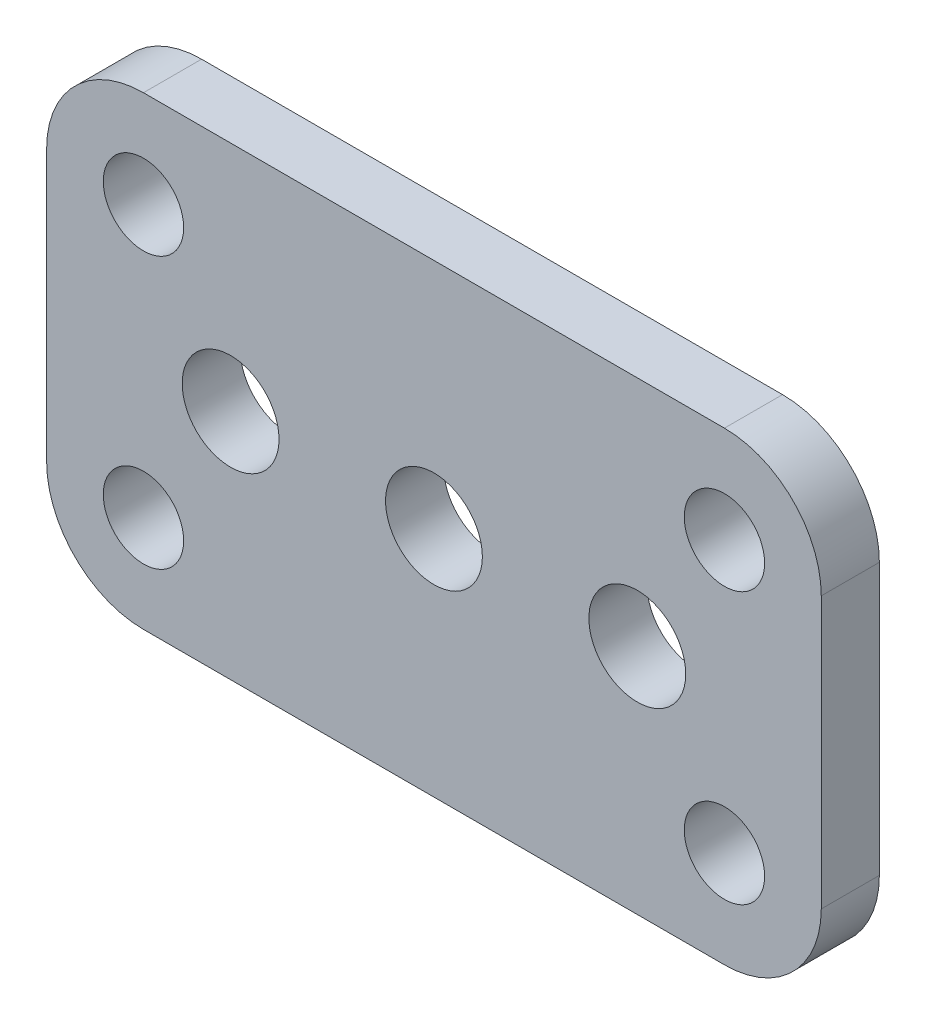
ISO-10303-21;
HEADER;
FILE_DESCRIPTION(('STEP AP214'),'2;1');
FILE_NAME('part.step','',(''),(''),'','','');
FILE_SCHEMA(('AUTOMOTIVE_DESIGN { 1 0 10303 214 1 1 1 1 }'));
ENDSEC;
DATA;
#1=APPLICATION_CONTEXT('core data for automotive mechanical design processes');
#2=APPLICATION_PROTOCOL_DEFINITION('international standard','automotive_design',2000,#1);
#3=PRODUCT_CONTEXT('',#1,'mechanical');
#4=PRODUCT('Part','Part','',(#3));
#5=PRODUCT_RELATED_PRODUCT_CATEGORY('part','',(#4));
#6=PRODUCT_DEFINITION_FORMATION('','',#4);
#7=PRODUCT_DEFINITION_CONTEXT('part definition',#1,'design');
#8=PRODUCT_DEFINITION('design','',#6,#7);
#9=PRODUCT_DEFINITION_SHAPE('','',#8);
#10=(LENGTH_UNIT() NAMED_UNIT(*) SI_UNIT(.MILLI.,.METRE.));
#11=(NAMED_UNIT(*) PLANE_ANGLE_UNIT() SI_UNIT($,.RADIAN.));
#12=(NAMED_UNIT(*) SI_UNIT($,.STERADIAN.) SOLID_ANGLE_UNIT());
#13=UNCERTAINTY_MEASURE_WITH_UNIT(LENGTH_MEASURE(1.E-05),#10,'distance_accuracy_value','');
#14=(GEOMETRIC_REPRESENTATION_CONTEXT(3) GLOBAL_UNCERTAINTY_ASSIGNED_CONTEXT((#13)) GLOBAL_UNIT_ASSIGNED_CONTEXT((#10,
#11,#12)) REPRESENTATION_CONTEXT('',''));
#15=CARTESIAN_POINT('',(0.,0.,0.));
#16=DIRECTION('',(0.,0.,1.));
#17=DIRECTION('',(1.,0.,0.));
#18=AXIS2_PLACEMENT_3D('',#15,#16,#17);
#19=CARTESIAN_POINT('',(15.0000000000007,7.,3.));
#20=DIRECTION('',(0.,0.,1.));
#21=DIRECTION('',(1.,0.,0.));
#22=AXIS2_PLACEMENT_3D('',#19,#20,#21);
#23=PLANE('',#22);
#24=CARTESIAN_POINT('',(15.0000000000007,-7.,3.));
#25=DIRECTION('',(0.,0.,1.));
#26=DIRECTION('',(1.,0.,0.));
#27=AXIS2_PLACEMENT_3D('',#24,#25,#26);
#28=CIRCLE('',#27,2.075);
#29=CARTESIAN_POINT('',(17.0750000000007,-7.,3.));
#30=VERTEX_POINT('',#29);
#31=EDGE_CURVE('E206',#30,#30,#28,.T.);
#32=ORIENTED_EDGE('',*,*,#31,.F.);
#33=EDGE_LOOP('',(#32));
#34=FACE_BOUND('',#33,.T.);
#35=CARTESIAN_POINT('',(-14.9999995529655,7.,3.));
#36=DIRECTION('',(0.,0.,1.));
#37=DIRECTION('',(1.,0.,0.));
#38=AXIS2_PLACEMENT_3D('',#35,#36,#37);
#39=CIRCLE('',#38,2.075);
#40=CARTESIAN_POINT('',(-12.9249995529655,7.,3.));
#41=VERTEX_POINT('',#40);
#42=EDGE_CURVE('E194',#41,#41,#39,.T.);
#43=ORIENTED_EDGE('',*,*,#42,.F.);
#44=EDGE_LOOP('',(#43));
#45=FACE_BOUND('',#44,.T.);
#46=CARTESIAN_POINT('',(-10.4999999999995,1.11022302462516E-13,3.));
#47=DIRECTION('',(0.,0.,1.));
#48=DIRECTION('',(1.,0.,0.));
#49=AXIS2_PLACEMENT_3D('',#46,#47,#48);
#50=CIRCLE('',#49,2.49999999999995);
#51=CARTESIAN_POINT('',(-7.99999999999956,1.11022302462516E-13,3.));
#52=VERTEX_POINT('',#51);
#53=EDGE_CURVE('E182',#52,#52,#50,.T.);
#54=ORIENTED_EDGE('',*,*,#53,.F.);
#55=EDGE_LOOP('',(#54));
#56=FACE_BOUND('',#55,.T.);
#57=CARTESIAN_POINT('',(15.0000000000007,7.,3.));
#58=DIRECTION('',(0.,0.,1.));
#59=DIRECTION('',(1.,0.,0.));
#60=AXIS2_PLACEMENT_3D('',#57,#58,#59);
#61=CIRCLE('',#60,5.00000000000006);
#62=CARTESIAN_POINT('',(20.0000000000007,7.,3.));
#63=VERTEX_POINT('',#62);
#64=CARTESIAN_POINT('',(15.0000000000007,12.0000000000001,3.));
#65=VERTEX_POINT('',#64);
#66=EDGE_CURVE('E145',#63,#65,#61,.T.);
#67=ORIENTED_EDGE('',*,*,#66,.T.);
#68=DIRECTION('',(-1.,0.,0.));
#69=VECTOR('',#68,1.);
#70=CARTESIAN_POINT('',(15.0000000000007,12.0000000000001,3.));
#71=LINE('',#70,#69);
#72=CARTESIAN_POINT('',(-14.9999995529655,12.000000223517,3.));
#73=VERTEX_POINT('',#72);
#74=EDGE_CURVE('E93',#65,#73,#71,.T.);
#75=ORIENTED_EDGE('',*,*,#74,.T.);
#76=CARTESIAN_POINT('',(-14.9999995529655,7.,3.));
#77=DIRECTION('',(0.,0.,1.));
#78=DIRECTION('',(1.,0.,0.));
#79=AXIS2_PLACEMENT_3D('',#76,#77,#78);
#80=CIRCLE('',#79,5.00000022351697);
#81=CARTESIAN_POINT('',(-19.9999999999993,7.,3.));
#82=VERTEX_POINT('',#81);
#83=EDGE_CURVE('E160',#73,#82,#80,.T.);
#84=ORIENTED_EDGE('',*,*,#83,.T.);
#85=DIRECTION('',(0.,-1.,0.));
#86=VECTOR('',#85,1.);
#87=CARTESIAN_POINT('',(-19.9999999999993,7.,3.));
#88=LINE('',#87,#86);
#89=CARTESIAN_POINT('',(-19.9999997764824,-7.,3.));
#90=VERTEX_POINT('',#89);
#91=EDGE_CURVE('E173',#82,#90,#88,.T.);
#92=ORIENTED_EDGE('',*,*,#91,.T.);
#93=CARTESIAN_POINT('',(-14.9999995529655,-7.,3.));
#94=DIRECTION('',(0.,0.,1.));
#95=DIRECTION('',(1.,0.,0.));
#96=AXIS2_PLACEMENT_3D('',#93,#94,#95);
#97=CIRCLE('',#96,5.00000022351687);
#98=CARTESIAN_POINT('',(-14.9999995529655,-11.9999999999999,3.));
#99=VERTEX_POINT('',#98);
#100=EDGE_CURVE('E112',#90,#99,#97,.T.);
#101=ORIENTED_EDGE('',*,*,#100,.T.);
#102=DIRECTION('',(1.,0.,0.));
#103=VECTOR('',#102,1.);
#104=CARTESIAN_POINT('',(-14.9999995529655,-11.9999999999999,3.));
#105=LINE('',#104,#103);
#106=CARTESIAN_POINT('',(15.0000000000007,-11.9999999999999,3.));
#107=VERTEX_POINT('',#106);
#108=EDGE_CURVE('E106',#99,#107,#105,.T.);
#109=ORIENTED_EDGE('',*,*,#108,.T.);
#110=CARTESIAN_POINT('',(15.0000000000007,-7.,3.));
#111=DIRECTION('',(0.,0.,1.));
#112=DIRECTION('',(1.,0.,0.));
#113=AXIS2_PLACEMENT_3D('',#110,#111,#112);
#114=CIRCLE('',#113,4.99999999999994);
#115=CARTESIAN_POINT('',(20.0000000000007,-7.,3.));
#116=VERTEX_POINT('',#115);
#117=EDGE_CURVE('E110',#107,#116,#114,.T.);
#118=ORIENTED_EDGE('',*,*,#117,.T.);
#119=DIRECTION('',(0.,1.,0.));
#120=VECTOR('',#119,1.);
#121=CARTESIAN_POINT('',(20.0000000000007,-7.,3.));
#122=LINE('',#121,#120);
#123=EDGE_CURVE('E50',#116,#63,#122,.T.);
#124=ORIENTED_EDGE('',*,*,#123,.T.);
#125=EDGE_LOOP('',(#67,#75,#84,#92,#101,#109,#118,#124));
#126=FACE_BOUND('',#125,.T.);
#127=CARTESIAN_POINT('',(6.66133814775094E-13,1.11022302462516E-13,3.));
#128=DIRECTION('',(0.,0.,1.));
#129=DIRECTION('',(1.,0.,0.));
#130=AXIS2_PLACEMENT_3D('',#127,#128,#129);
#131=CIRCLE('',#130,2.49999999999995);
#132=CARTESIAN_POINT('',(2.50000000000061,1.11022302462516E-13,3.));
#133=VERTEX_POINT('',#132);
#134=EDGE_CURVE('E134',#133,#133,#131,.T.);
#135=ORIENTED_EDGE('',*,*,#134,.F.);
#136=EDGE_LOOP('',(#135));
#137=FACE_BOUND('',#136,.T.);
#138=CARTESIAN_POINT('',(10.5000000000006,1.11022302462516E-13,3.));
#139=DIRECTION('',(0.,0.,1.));
#140=DIRECTION('',(1.,0.,0.));
#141=AXIS2_PLACEMENT_3D('',#138,#139,#140);
#142=CIRCLE('',#141,2.49999999999995);
#143=CARTESIAN_POINT('',(13.0000000000006,1.11022302462516E-13,3.));
#144=VERTEX_POINT('',#143);
#145=EDGE_CURVE('E188',#144,#144,#142,.T.);
#146=ORIENTED_EDGE('',*,*,#145,.F.);
#147=EDGE_LOOP('',(#146));
#148=FACE_BOUND('',#147,.T.);
#149=CARTESIAN_POINT('',(15.0000000000007,7.,3.));
#150=DIRECTION('',(0.,0.,1.));
#151=DIRECTION('',(1.,0.,0.));
#152=AXIS2_PLACEMENT_3D('',#149,#150,#151);
#153=CIRCLE('',#152,2.075);
#154=CARTESIAN_POINT('',(17.0750000000007,7.,3.));
#155=VERTEX_POINT('',#154);
#156=EDGE_CURVE('E200',#155,#155,#153,.T.);
#157=ORIENTED_EDGE('',*,*,#156,.F.);
#158=EDGE_LOOP('',(#157));
#159=FACE_BOUND('',#158,.T.);
#160=CARTESIAN_POINT('',(-14.9999995529655,-7.,3.));
#161=DIRECTION('',(0.,0.,1.));
#162=DIRECTION('',(1.,0.,0.));
#163=AXIS2_PLACEMENT_3D('',#160,#161,#162);
#164=CIRCLE('',#163,2.075);
#165=CARTESIAN_POINT('',(-12.9249995529655,-7.,3.));
#166=VERTEX_POINT('',#165);
#167=EDGE_CURVE('E212',#166,#166,#164,.T.);
#168=ORIENTED_EDGE('',*,*,#167,.F.);
#169=EDGE_LOOP('',(#168));
#170=FACE_BOUND('',#169,.T.);
#171=ADVANCED_FACE('F33',(#34,#45,#56,#126,#137,#148,#159,#170),#23,.T.);
#172=CARTESIAN_POINT('',(15.0000000000007,7.,0.));
#173=DIRECTION('',(0.,0.,1.));
#174=DIRECTION('',(1.,0.,0.));
#175=AXIS2_PLACEMENT_3D('',#172,#173,#174);
#176=PLANE('',#175);
#177=CARTESIAN_POINT('',(15.0000000000007,7.,0.));
#178=DIRECTION('',(0.,0.,1.));
#179=DIRECTION('',(1.,0.,0.));
#180=AXIS2_PLACEMENT_3D('',#177,#178,#179);
#181=CIRCLE('',#180,5.00000000000006);
#182=CARTESIAN_POINT('',(20.0000000000007,7.,0.));
#183=VERTEX_POINT('',#182);
#184=CARTESIAN_POINT('',(15.0000000000007,12.0000000000001,0.));
#185=VERTEX_POINT('',#184);
#186=EDGE_CURVE('E130',#183,#185,#181,.T.);
#187=ORIENTED_EDGE('',*,*,#186,.F.);
#188=DIRECTION('',(0.,1.,0.));
#189=VECTOR('',#188,1.);
#190=CARTESIAN_POINT('',(20.0000000000007,-7.,0.));
#191=LINE('',#190,#189);
#192=CARTESIAN_POINT('',(20.0000000000007,-7.,0.));
#193=VERTEX_POINT('',#192);
#194=EDGE_CURVE('E85',#193,#183,#191,.T.);
#195=ORIENTED_EDGE('',*,*,#194,.F.);
#196=CARTESIAN_POINT('',(15.0000000000007,-7.,0.));
#197=DIRECTION('',(0.,0.,1.));
#198=DIRECTION('',(1.,0.,0.));
#199=AXIS2_PLACEMENT_3D('',#196,#197,#198);
#200=CIRCLE('',#199,4.99999999999994);
#201=CARTESIAN_POINT('',(15.0000000000007,-11.9999999999999,0.));
#202=VERTEX_POINT('',#201);
#203=EDGE_CURVE('E79',#202,#193,#200,.T.);
#204=ORIENTED_EDGE('',*,*,#203,.F.);
#205=DIRECTION('',(1.,0.,0.));
#206=VECTOR('',#205,1.);
#207=CARTESIAN_POINT('',(-14.9999995529655,-11.9999999999999,0.));
#208=LINE('',#207,#206);
#209=CARTESIAN_POINT('',(-14.9999995529655,-11.9999999999999,0.));
#210=VERTEX_POINT('',#209);
#211=EDGE_CURVE('E120',#210,#202,#208,.T.);
#212=ORIENTED_EDGE('',*,*,#211,.F.);
#213=CARTESIAN_POINT('',(-14.9999995529655,-7.,0.));
#214=DIRECTION('',(0.,0.,1.));
#215=DIRECTION('',(1.,0.,0.));
#216=AXIS2_PLACEMENT_3D('',#213,#214,#215);
#217=CIRCLE('',#216,5.00000022351687);
#218=CARTESIAN_POINT('',(-19.9999997764824,-7.,0.));
#219=VERTEX_POINT('',#218);
#220=EDGE_CURVE('E140',#219,#210,#217,.T.);
#221=ORIENTED_EDGE('',*,*,#220,.F.);
#222=DIRECTION('',(0.,-1.,0.));
#223=VECTOR('',#222,1.);
#224=CARTESIAN_POINT('',(-19.9999999999993,7.,0.));
#225=LINE('',#224,#223);
#226=CARTESIAN_POINT('',(-19.9999999999993,7.,0.));
#227=VERTEX_POINT('',#226);
#228=EDGE_CURVE('E138',#227,#219,#225,.T.);
#229=ORIENTED_EDGE('',*,*,#228,.F.);
#230=CARTESIAN_POINT('',(-14.9999995529655,7.,0.));
#231=DIRECTION('',(0.,0.,1.));
#232=DIRECTION('',(1.,0.,0.));
#233=AXIS2_PLACEMENT_3D('',#230,#231,#232);
#234=CIRCLE('',#233,5.00000022351697);
#235=CARTESIAN_POINT('',(-14.9999995529655,12.000000223517,0.));
#236=VERTEX_POINT('',#235);
#237=EDGE_CURVE('E136',#236,#227,#234,.T.);
#238=ORIENTED_EDGE('',*,*,#237,.F.);
#239=DIRECTION('',(-1.,0.,0.));
#240=VECTOR('',#239,1.);
#241=CARTESIAN_POINT('',(15.0000000000007,12.0000000000001,0.));
#242=LINE('',#241,#240);
#243=EDGE_CURVE('E133',#185,#236,#242,.T.);
#244=ORIENTED_EDGE('',*,*,#243,.F.);
#245=EDGE_LOOP('',(#187,#195,#204,#212,#221,#229,#238,#244));
#246=FACE_BOUND('',#245,.T.);
#247=CARTESIAN_POINT('',(6.66133814775094E-13,1.11022302462516E-13,0.));
#248=DIRECTION('',(0.,0.,1.));
#249=DIRECTION('',(1.,0.,0.));
#250=AXIS2_PLACEMENT_3D('',#247,#248,#249);
#251=CIRCLE('',#250,2.49999999999995);
#252=CARTESIAN_POINT('',(2.50000000000061,1.11022302462516E-13,0.));
#253=VERTEX_POINT('',#252);
#254=EDGE_CURVE('E179',#253,#253,#251,.T.);
#255=ORIENTED_EDGE('',*,*,#254,.T.);
#256=EDGE_LOOP('',(#255));
#257=FACE_BOUND('',#256,.T.);
#258=CARTESIAN_POINT('',(-10.4999999999995,1.11022302462516E-13,0.));
#259=DIRECTION('',(0.,0.,1.));
#260=DIRECTION('',(1.,0.,0.));
#261=AXIS2_PLACEMENT_3D('',#258,#259,#260);
#262=CIRCLE('',#261,2.49999999999995);
#263=CARTESIAN_POINT('',(-7.99999999999956,1.11022302462516E-13,0.));
#264=VERTEX_POINT('',#263);
#265=EDGE_CURVE('E185',#264,#264,#262,.T.);
#266=ORIENTED_EDGE('',*,*,#265,.T.);
#267=EDGE_LOOP('',(#266));
#268=FACE_BOUND('',#267,.T.);
#269=CARTESIAN_POINT('',(10.5000000000006,1.11022302462516E-13,0.));
#270=DIRECTION('',(0.,0.,1.));
#271=DIRECTION('',(1.,0.,0.));
#272=AXIS2_PLACEMENT_3D('',#269,#270,#271);
#273=CIRCLE('',#272,2.49999999999995);
#274=CARTESIAN_POINT('',(13.0000000000006,1.11022302462516E-13,0.));
#275=VERTEX_POINT('',#274);
#276=EDGE_CURVE('E191',#275,#275,#273,.T.);
#277=ORIENTED_EDGE('',*,*,#276,.T.);
#278=EDGE_LOOP('',(#277));
#279=FACE_BOUND('',#278,.T.);
#280=CARTESIAN_POINT('',(-14.9999995529655,7.,0.));
#281=DIRECTION('',(0.,0.,1.));
#282=DIRECTION('',(1.,0.,0.));
#283=AXIS2_PLACEMENT_3D('',#280,#281,#282);
#284=CIRCLE('',#283,2.075);
#285=CARTESIAN_POINT('',(-12.9249995529655,7.,0.));
#286=VERTEX_POINT('',#285);
#287=EDGE_CURVE('E197',#286,#286,#284,.T.);
#288=ORIENTED_EDGE('',*,*,#287,.T.);
#289=EDGE_LOOP('',(#288));
#290=FACE_BOUND('',#289,.T.);
#291=CARTESIAN_POINT('',(15.0000000000007,7.,0.));
#292=DIRECTION('',(0.,0.,1.));
#293=DIRECTION('',(1.,0.,0.));
#294=AXIS2_PLACEMENT_3D('',#291,#292,#293);
#295=CIRCLE('',#294,2.075);
#296=CARTESIAN_POINT('',(17.0750000000007,7.,0.));
#297=VERTEX_POINT('',#296);
#298=EDGE_CURVE('E203',#297,#297,#295,.T.);
#299=ORIENTED_EDGE('',*,*,#298,.T.);
#300=EDGE_LOOP('',(#299));
#301=FACE_BOUND('',#300,.T.);
#302=CARTESIAN_POINT('',(15.0000000000007,-7.,0.));
#303=DIRECTION('',(0.,0.,1.));
#304=DIRECTION('',(1.,0.,0.));
#305=AXIS2_PLACEMENT_3D('',#302,#303,#304);
#306=CIRCLE('',#305,2.075);
#307=CARTESIAN_POINT('',(17.0750000000007,-7.,0.));
#308=VERTEX_POINT('',#307);
#309=EDGE_CURVE('E209',#308,#308,#306,.T.);
#310=ORIENTED_EDGE('',*,*,#309,.T.);
#311=EDGE_LOOP('',(#310));
#312=FACE_BOUND('',#311,.T.);
#313=CARTESIAN_POINT('',(-14.9999995529655,-7.,0.));
#314=DIRECTION('',(0.,0.,1.));
#315=DIRECTION('',(1.,0.,0.));
#316=AXIS2_PLACEMENT_3D('',#313,#314,#315);
#317=CIRCLE('',#316,2.075);
#318=CARTESIAN_POINT('',(-12.9249995529655,-7.,0.));
#319=VERTEX_POINT('',#318);
#320=EDGE_CURVE('E215',#319,#319,#317,.T.);
#321=ORIENTED_EDGE('',*,*,#320,.T.);
#322=EDGE_LOOP('',(#321));
#323=FACE_BOUND('',#322,.T.);
#324=ADVANCED_FACE('F164',(#246,#257,#268,#279,#290,#301,#312,#323),#176,.F.);
#325=CARTESIAN_POINT('',(15.0000000000007,7.,3.));
#326=DIRECTION('',(0.,0.,-1.));
#327=DIRECTION('',(-1.,0.,0.));
#328=AXIS2_PLACEMENT_3D('',#325,#326,#327);
#329=CYLINDRICAL_SURFACE('',#328,5.00000000000006);
#330=ORIENTED_EDGE('',*,*,#186,.T.);
#331=DIRECTION('',(0.,0.,-1.));
#332=VECTOR('',#331,1.);
#333=CARTESIAN_POINT('',(15.0000000000007,12.0000000000001,3.));
#334=LINE('',#333,#332);
#335=EDGE_CURVE('E11',#65,#185,#334,.T.);
#336=ORIENTED_EDGE('',*,*,#335,.F.);
#337=ORIENTED_EDGE('',*,*,#66,.F.);
#338=DIRECTION('',(0.,0.,-1.));
#339=VECTOR('',#338,1.);
#340=CARTESIAN_POINT('',(20.0000000000007,7.,3.));
#341=LINE('',#340,#339);
#342=EDGE_CURVE('E126',#63,#183,#341,.T.);
#343=ORIENTED_EDGE('',*,*,#342,.T.);
#344=EDGE_LOOP('',(#330,#336,#337,#343));
#345=FACE_BOUND('',#344,.T.);
#346=ADVANCED_FACE('F35',(#345),#329,.T.);
#347=CARTESIAN_POINT('',(15.0000000000007,12.0000000000001,3.));
#348=DIRECTION('',(0.,-1.,0.));
#349=DIRECTION('',(1.,0.,0.));
#350=AXIS2_PLACEMENT_3D('',#347,#348,#349);
#351=PLANE('',#350);
#352=ORIENTED_EDGE('',*,*,#243,.T.);
#353=DIRECTION('',(0.,0.,-1.));
#354=VECTOR('',#353,1.);
#355=CARTESIAN_POINT('',(-14.9999995529655,12.000000223517,3.));
#356=LINE('',#355,#354);
#357=EDGE_CURVE('E42',#73,#236,#356,.T.);
#358=ORIENTED_EDGE('',*,*,#357,.F.);
#359=ORIENTED_EDGE('',*,*,#74,.F.);
#360=ORIENTED_EDGE('',*,*,#335,.T.);
#361=EDGE_LOOP('',(#352,#358,#359,#360));
#362=FACE_BOUND('',#361,.T.);
#363=ADVANCED_FACE('F249',(#362),#351,.F.);
#364=CARTESIAN_POINT('',(-14.9999995529655,7.,3.));
#365=DIRECTION('',(0.,0.,-1.));
#366=DIRECTION('',(-1.,0.,0.));
#367=AXIS2_PLACEMENT_3D('',#364,#365,#366);
#368=CYLINDRICAL_SURFACE('',#367,5.00000022351697);
#369=ORIENTED_EDGE('',*,*,#237,.T.);
#370=DIRECTION('',(0.,0.,-1.));
#371=VECTOR('',#370,1.);
#372=CARTESIAN_POINT('',(-19.9999999999993,7.,3.));
#373=LINE('',#372,#371);
#374=EDGE_CURVE('E152',#82,#227,#373,.T.);
#375=ORIENTED_EDGE('',*,*,#374,.F.);
#376=ORIENTED_EDGE('',*,*,#83,.F.);
#377=ORIENTED_EDGE('',*,*,#357,.T.);
#378=EDGE_LOOP('',(#369,#375,#376,#377));
#379=FACE_BOUND('',#378,.T.);
#380=ADVANCED_FACE('F158',(#379),#368,.T.);
#381=CARTESIAN_POINT('',(-19.9999999999993,7.,3.));
#382=DIRECTION('',(1.,0.,0.));
#383=DIRECTION('',(0.,1.,0.));
#384=AXIS2_PLACEMENT_3D('',#381,#382,#383);
#385=PLANE('',#384);
#386=ORIENTED_EDGE('',*,*,#228,.T.);
#387=DIRECTION('',(0.,0.,-1.));
#388=VECTOR('',#387,1.);
#389=CARTESIAN_POINT('',(-19.9999997764824,-7.,3.));
#390=LINE('',#389,#388);
#391=EDGE_CURVE('E149',#90,#219,#390,.T.);
#392=ORIENTED_EDGE('',*,*,#391,.F.);
#393=ORIENTED_EDGE('',*,*,#91,.F.);
#394=ORIENTED_EDGE('',*,*,#374,.T.);
#395=EDGE_LOOP('',(#386,#392,#393,#394));
#396=FACE_BOUND('',#395,.T.);
#397=ADVANCED_FACE('F169',(#396),#385,.F.);
#398=CARTESIAN_POINT('',(-14.9999995529655,-7.,3.));
#399=DIRECTION('',(0.,0.,-1.));
#400=DIRECTION('',(-1.,0.,0.));
#401=AXIS2_PLACEMENT_3D('',#398,#399,#400);
#402=CYLINDRICAL_SURFACE('',#401,5.00000022351687);
#403=ORIENTED_EDGE('',*,*,#220,.T.);
#404=DIRECTION('',(0.,0.,-1.));
#405=VECTOR('',#404,1.);
#406=CARTESIAN_POINT('',(-14.9999995529655,-11.9999999999999,3.));
#407=LINE('',#406,#405);
#408=EDGE_CURVE('E121',#99,#210,#407,.T.);
#409=ORIENTED_EDGE('',*,*,#408,.F.);
#410=ORIENTED_EDGE('',*,*,#100,.F.);
#411=ORIENTED_EDGE('',*,*,#391,.T.);
#412=EDGE_LOOP('',(#403,#409,#410,#411));
#413=FACE_BOUND('',#412,.T.);
#414=ADVANCED_FACE('F172',(#413),#402,.T.);
#415=CARTESIAN_POINT('',(-14.9999995529655,-11.9999999999999,3.));
#416=DIRECTION('',(0.,1.,0.));
#417=DIRECTION('',(-1.,0.,0.));
#418=AXIS2_PLACEMENT_3D('',#415,#416,#417);
#419=PLANE('',#418);
#420=ORIENTED_EDGE('',*,*,#211,.T.);
#421=DIRECTION('',(0.,0.,-1.));
#422=VECTOR('',#421,1.);
#423=CARTESIAN_POINT('',(15.0000000000007,-11.9999999999999,3.));
#424=LINE('',#423,#422);
#425=EDGE_CURVE('E117',#107,#202,#424,.T.);
#426=ORIENTED_EDGE('',*,*,#425,.F.);
#427=ORIENTED_EDGE('',*,*,#108,.F.);
#428=ORIENTED_EDGE('',*,*,#408,.T.);
#429=EDGE_LOOP('',(#420,#426,#427,#428));
#430=FACE_BOUND('',#429,.T.);
#431=ADVANCED_FACE('F118',(#430),#419,.F.);
#432=CARTESIAN_POINT('',(15.0000000000007,-7.,3.));
#433=DIRECTION('',(0.,0.,-1.));
#434=DIRECTION('',(-1.,0.,0.));
#435=AXIS2_PLACEMENT_3D('',#432,#433,#434);
#436=CYLINDRICAL_SURFACE('',#435,4.99999999999994);
#437=ORIENTED_EDGE('',*,*,#203,.T.);
#438=DIRECTION('',(0.,0.,-1.));
#439=VECTOR('',#438,1.);
#440=CARTESIAN_POINT('',(20.0000000000007,-7.,3.));
#441=LINE('',#440,#439);
#442=EDGE_CURVE('E122',#116,#193,#441,.T.);
#443=ORIENTED_EDGE('',*,*,#442,.F.);
#444=ORIENTED_EDGE('',*,*,#117,.F.);
#445=ORIENTED_EDGE('',*,*,#425,.T.);
#446=EDGE_LOOP('',(#437,#443,#444,#445));
#447=FACE_BOUND('',#446,.T.);
#448=ADVANCED_FACE('F124',(#447),#436,.T.);
#449=CARTESIAN_POINT('',(20.0000000000007,-7.,3.));
#450=DIRECTION('',(-1.,0.,0.));
#451=DIRECTION('',(0.,0.,1.));
#452=AXIS2_PLACEMENT_3D('',#449,#450,#451);
#453=PLANE('',#452);
#454=ORIENTED_EDGE('',*,*,#194,.T.);
#455=ORIENTED_EDGE('',*,*,#342,.F.);
#456=ORIENTED_EDGE('',*,*,#123,.F.);
#457=ORIENTED_EDGE('',*,*,#442,.T.);
#458=EDGE_LOOP('',(#454,#455,#456,#457));
#459=FACE_BOUND('',#458,.T.);
#460=ADVANCED_FACE('F237',(#459),#453,.F.);
#461=CARTESIAN_POINT('',(6.66133814775094E-13,1.11022302462516E-13,3.));
#462=DIRECTION('',(0.,0.,-1.));
#463=DIRECTION('',(-1.,0.,0.));
#464=AXIS2_PLACEMENT_3D('',#461,#462,#463);
#465=CYLINDRICAL_SURFACE('',#464,2.49999999999995);
#466=ORIENTED_EDGE('',*,*,#134,.T.);
#467=EDGE_LOOP('',(#466));
#468=FACE_BOUND('',#467,.T.);
#469=ORIENTED_EDGE('',*,*,#254,.F.);
#470=EDGE_LOOP('',(#469));
#471=FACE_BOUND('',#470,.T.);
#472=ADVANCED_FACE('F234',(#468,#471),#465,.F.);
#473=CARTESIAN_POINT('',(-10.4999999999995,1.11022302462516E-13,3.));
#474=DIRECTION('',(0.,0.,-1.));
#475=DIRECTION('',(-1.,0.,0.));
#476=AXIS2_PLACEMENT_3D('',#473,#474,#475);
#477=CYLINDRICAL_SURFACE('',#476,2.49999999999995);
#478=ORIENTED_EDGE('',*,*,#53,.T.);
#479=EDGE_LOOP('',(#478));
#480=FACE_BOUND('',#479,.T.);
#481=ORIENTED_EDGE('',*,*,#265,.F.);
#482=EDGE_LOOP('',(#481));
#483=FACE_BOUND('',#482,.T.);
#484=ADVANCED_FACE('F313',(#480,#483),#477,.F.);
#485=CARTESIAN_POINT('',(10.5000000000006,1.11022302462516E-13,3.));
#486=DIRECTION('',(0.,0.,-1.));
#487=DIRECTION('',(-1.,0.,0.));
#488=AXIS2_PLACEMENT_3D('',#485,#486,#487);
#489=CYLINDRICAL_SURFACE('',#488,2.49999999999995);
#490=ORIENTED_EDGE('',*,*,#145,.T.);
#491=EDGE_LOOP('',(#490));
#492=FACE_BOUND('',#491,.T.);
#493=ORIENTED_EDGE('',*,*,#276,.F.);
#494=EDGE_LOOP('',(#493));
#495=FACE_BOUND('',#494,.T.);
#496=ADVANCED_FACE('F321',(#492,#495),#489,.F.);
#497=CARTESIAN_POINT('',(-14.9999995529655,7.,3.));
#498=DIRECTION('',(0.,0.,-1.));
#499=DIRECTION('',(-1.,0.,0.));
#500=AXIS2_PLACEMENT_3D('',#497,#498,#499);
#501=CYLINDRICAL_SURFACE('',#500,2.075);
#502=ORIENTED_EDGE('',*,*,#42,.T.);
#503=EDGE_LOOP('',(#502));
#504=FACE_BOUND('',#503,.T.);
#505=ORIENTED_EDGE('',*,*,#287,.F.);
#506=EDGE_LOOP('',(#505));
#507=FACE_BOUND('',#506,.T.);
#508=ADVANCED_FACE('F329',(#504,#507),#501,.F.);
#509=CARTESIAN_POINT('',(15.0000000000007,7.,3.));
#510=DIRECTION('',(0.,0.,-1.));
#511=DIRECTION('',(-1.,0.,0.));
#512=AXIS2_PLACEMENT_3D('',#509,#510,#511);
#513=CYLINDRICAL_SURFACE('',#512,2.075);
#514=ORIENTED_EDGE('',*,*,#156,.T.);
#515=EDGE_LOOP('',(#514));
#516=FACE_BOUND('',#515,.T.);
#517=ORIENTED_EDGE('',*,*,#298,.F.);
#518=EDGE_LOOP('',(#517));
#519=FACE_BOUND('',#518,.T.);
#520=ADVANCED_FACE('F338',(#516,#519),#513,.F.);
#521=CARTESIAN_POINT('',(15.0000000000007,-7.,3.));
#522=DIRECTION('',(0.,0.,-1.));
#523=DIRECTION('',(-1.,0.,0.));
#524=AXIS2_PLACEMENT_3D('',#521,#522,#523);
#525=CYLINDRICAL_SURFACE('',#524,2.075);
#526=ORIENTED_EDGE('',*,*,#31,.T.);
#527=EDGE_LOOP('',(#526));
#528=FACE_BOUND('',#527,.T.);
#529=ORIENTED_EDGE('',*,*,#309,.F.);
#530=EDGE_LOOP('',(#529));
#531=FACE_BOUND('',#530,.T.);
#532=ADVANCED_FACE('F347',(#528,#531),#525,.F.);
#533=CARTESIAN_POINT('',(-14.9999995529655,-7.,3.));
#534=DIRECTION('',(0.,0.,-1.));
#535=DIRECTION('',(-1.,0.,0.));
#536=AXIS2_PLACEMENT_3D('',#533,#534,#535);
#537=CYLINDRICAL_SURFACE('',#536,2.075);
#538=ORIENTED_EDGE('',*,*,#167,.T.);
#539=EDGE_LOOP('',(#538));
#540=FACE_BOUND('',#539,.T.);
#541=ORIENTED_EDGE('',*,*,#320,.F.);
#542=EDGE_LOOP('',(#541));
#543=FACE_BOUND('',#542,.T.);
#544=ADVANCED_FACE('F221',(#540,#543),#537,.F.);
#545=CLOSED_SHELL('',(#171,#324,#346,#363,#380,#397,#414,#431,#448,#460,#472,#484,#496,#508,
#520,#532,#544));
#546=MANIFOLD_SOLID_BREP('B2',#545);
#547=ADVANCED_BREP_SHAPE_REPRESENTATION('',(#18,#546),#14);
#548=SHAPE_DEFINITION_REPRESENTATION(#9,#547);
ENDSEC;
END-ISO-10303-21;
